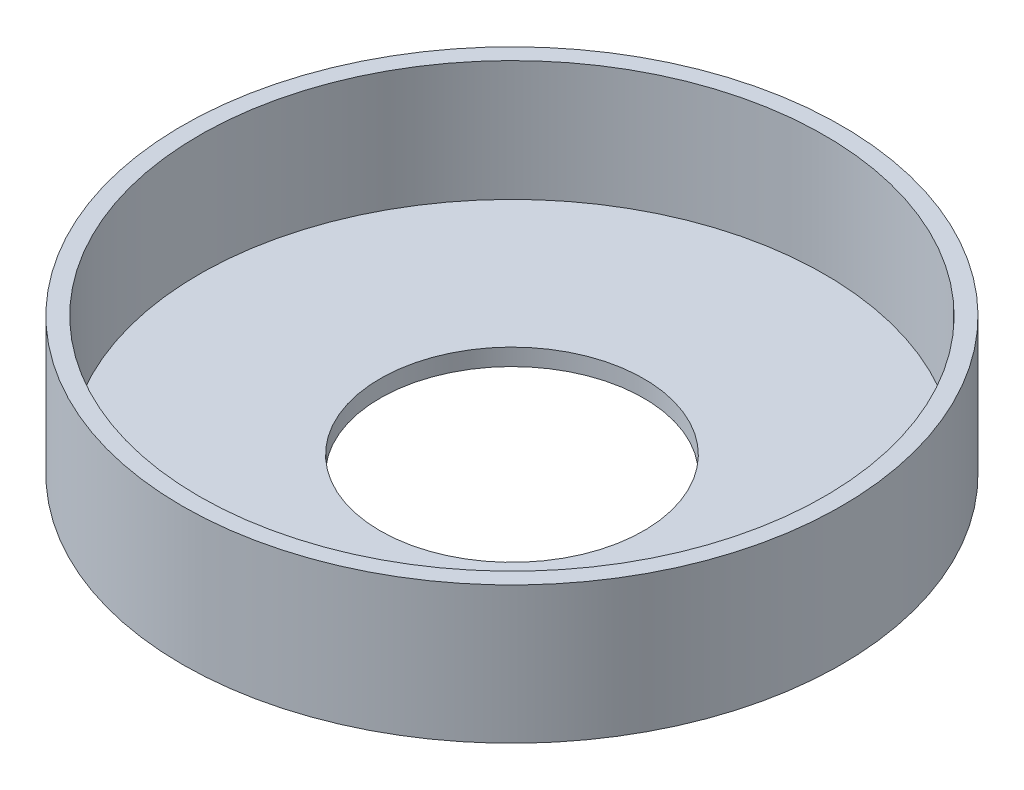
ISO-10303-21;
HEADER;
FILE_DESCRIPTION(('STEP AP214'),'2;1');
FILE_NAME('part.step','',(''),(''),'','','');
FILE_SCHEMA(('AUTOMOTIVE_DESIGN { 1 0 10303 214 1 1 1 1 }'));
ENDSEC;
DATA;
#1=APPLICATION_CONTEXT('core data for automotive mechanical design processes');
#2=APPLICATION_PROTOCOL_DEFINITION('international standard','automotive_design',2000,#1);
#3=PRODUCT_CONTEXT('',#1,'mechanical');
#4=PRODUCT('Part','Part','',(#3));
#5=PRODUCT_RELATED_PRODUCT_CATEGORY('part','',(#4));
#6=PRODUCT_DEFINITION_FORMATION('','',#4);
#7=PRODUCT_DEFINITION_CONTEXT('part definition',#1,'design');
#8=PRODUCT_DEFINITION('design','',#6,#7);
#9=PRODUCT_DEFINITION_SHAPE('','',#8);
#10=(LENGTH_UNIT() NAMED_UNIT(*) SI_UNIT(.MILLI.,.METRE.));
#11=(NAMED_UNIT(*) PLANE_ANGLE_UNIT() SI_UNIT($,.RADIAN.));
#12=(NAMED_UNIT(*) SI_UNIT($,.STERADIAN.) SOLID_ANGLE_UNIT());
#13=UNCERTAINTY_MEASURE_WITH_UNIT(LENGTH_MEASURE(1.E-05),#10,'distance_accuracy_value','');
#14=(GEOMETRIC_REPRESENTATION_CONTEXT(3) GLOBAL_UNCERTAINTY_ASSIGNED_CONTEXT((#13)) GLOBAL_UNIT_ASSIGNED_CONTEXT((#10,
#11,#12)) REPRESENTATION_CONTEXT('',''));
#15=CARTESIAN_POINT('',(0.,0.,0.));
#16=DIRECTION('',(0.,0.,1.));
#17=DIRECTION('',(1.,0.,0.));
#18=AXIS2_PLACEMENT_3D('',#15,#16,#17);
#19=CARTESIAN_POINT('',(0.,1.6,0.));
#20=DIRECTION('',(0.,1.,0.));
#21=DIRECTION('',(0.,0.,1.));
#22=AXIS2_PLACEMENT_3D('',#19,#20,#21);
#23=PLANE('',#22);
#24=CARTESIAN_POINT('',(0.,1.6,0.));
#25=DIRECTION('',(0.,1.,0.));
#26=DIRECTION('',(0.,0.,1.));
#27=AXIS2_PLACEMENT_3D('',#24,#25,#26);
#28=CIRCLE('',#27,12.5);
#29=CARTESIAN_POINT('',(0.,1.6,12.5));
#30=VERTEX_POINT('',#29);
#31=EDGE_CURVE('E41',#30,#30,#28,.T.);
#32=ORIENTED_EDGE('',*,*,#31,.F.);
#33=EDGE_LOOP('',(#32));
#34=FACE_BOUND('',#33,.T.);
#35=CARTESIAN_POINT('',(0.,1.6,0.));
#36=DIRECTION('',(0.,1.,0.));
#37=DIRECTION('',(0.,0.,1.));
#38=AXIS2_PLACEMENT_3D('',#35,#36,#37);
#39=CIRCLE('',#38,29.65);
#40=CARTESIAN_POINT('',(0.,1.6,29.65));
#41=VERTEX_POINT('',#40);
#42=EDGE_CURVE('E10',#41,#41,#39,.F.);
#43=ORIENTED_EDGE('',*,*,#42,.F.);
#44=EDGE_LOOP('',(#43));
#45=FACE_BOUND('',#44,.T.);
#46=ADVANCED_FACE('F30',(#34,#45),#23,.T.);
#47=CARTESIAN_POINT('',(0.,0.,0.));
#48=DIRECTION('',(0.,1.,0.));
#49=DIRECTION('',(0.,0.,1.));
#50=AXIS2_PLACEMENT_3D('',#47,#48,#49);
#51=PLANE('',#50);
#52=CARTESIAN_POINT('',(0.,0.,0.));
#53=DIRECTION('',(0.,1.,0.));
#54=DIRECTION('',(0.,0.,1.));
#55=AXIS2_PLACEMENT_3D('',#52,#53,#54);
#56=CIRCLE('',#55,31.25);
#57=CARTESIAN_POINT('',(0.,0.,31.25));
#58=VERTEX_POINT('',#57);
#59=EDGE_CURVE('E37',#58,#58,#56,.T.);
#60=ORIENTED_EDGE('',*,*,#59,.F.);
#61=EDGE_LOOP('',(#60));
#62=FACE_BOUND('',#61,.T.);
#63=CARTESIAN_POINT('',(0.,0.,0.));
#64=DIRECTION('',(0.,1.,0.));
#65=DIRECTION('',(0.,0.,1.));
#66=AXIS2_PLACEMENT_3D('',#63,#64,#65);
#67=CIRCLE('',#66,12.5);
#68=CARTESIAN_POINT('',(0.,0.,12.5));
#69=VERTEX_POINT('',#68);
#70=EDGE_CURVE('E45',#69,#69,#67,.T.);
#71=ORIENTED_EDGE('',*,*,#70,.T.);
#72=EDGE_LOOP('',(#71));
#73=FACE_BOUND('',#72,.T.);
#74=ADVANCED_FACE('F72',(#62,#73),#51,.F.);
#75=CARTESIAN_POINT('',(0.,1.6,0.));
#76=DIRECTION('',(0.,-1.,0.));
#77=DIRECTION('',(0.,0.,-1.));
#78=AXIS2_PLACEMENT_3D('',#75,#76,#77);
#79=CYLINDRICAL_SURFACE('',#78,31.25);
#80=ORIENTED_EDGE('',*,*,#59,.T.);
#81=EDGE_LOOP('',(#80));
#82=FACE_BOUND('',#81,.T.);
#83=CARTESIAN_POINT('',(0.,13.,0.));
#84=DIRECTION('',(0.,1.,0.));
#85=DIRECTION('',(0.,0.,1.));
#86=AXIS2_PLACEMENT_3D('',#83,#84,#85);
#87=CIRCLE('',#86,31.25);
#88=CARTESIAN_POINT('',(0.,13.,31.25));
#89=VERTEX_POINT('',#88);
#90=EDGE_CURVE('E49',#89,#89,#87,.T.);
#91=ORIENTED_EDGE('',*,*,#90,.F.);
#92=EDGE_LOOP('',(#91));
#93=FACE_BOUND('',#92,.T.);
#94=ADVANCED_FACE('F32',(#82,#93),#79,.T.);
#95=CARTESIAN_POINT('',(0.,1.6,0.));
#96=DIRECTION('',(0.,-1.,0.));
#97=DIRECTION('',(0.,0.,-1.));
#98=AXIS2_PLACEMENT_3D('',#95,#96,#97);
#99=CYLINDRICAL_SURFACE('',#98,12.5);
#100=ORIENTED_EDGE('',*,*,#31,.T.);
#101=EDGE_LOOP('',(#100));
#102=FACE_BOUND('',#101,.T.);
#103=ORIENTED_EDGE('',*,*,#70,.F.);
#104=EDGE_LOOP('',(#103));
#105=FACE_BOUND('',#104,.T.);
#106=ADVANCED_FACE('F61',(#102,#105),#99,.F.);
#107=CARTESIAN_POINT('',(0.,13.,0.));
#108=DIRECTION('',(0.,1.,0.));
#109=DIRECTION('',(0.,0.,1.));
#110=AXIS2_PLACEMENT_3D('',#107,#108,#109);
#111=PLANE('',#110);
#112=ORIENTED_EDGE('',*,*,#90,.T.);
#113=EDGE_LOOP('',(#112));
#114=FACE_BOUND('',#113,.T.);
#115=CARTESIAN_POINT('',(0.,13.,0.));
#116=DIRECTION('',(0.,1.,0.));
#117=DIRECTION('',(0.,0.,1.));
#118=AXIS2_PLACEMENT_3D('',#115,#116,#117);
#119=CIRCLE('',#118,29.65);
#120=CARTESIAN_POINT('',(0.,13.,29.65));
#121=VERTEX_POINT('',#120);
#122=EDGE_CURVE('E53',#121,#121,#119,.T.);
#123=ORIENTED_EDGE('',*,*,#122,.F.);
#124=EDGE_LOOP('',(#123));
#125=FACE_BOUND('',#124,.T.);
#126=ADVANCED_FACE('F59',(#114,#125),#111,.T.);
#127=CARTESIAN_POINT('',(0.,13.,0.));
#128=DIRECTION('',(0.,-1.,0.));
#129=DIRECTION('',(0.,0.,-1.));
#130=AXIS2_PLACEMENT_3D('',#127,#128,#129);
#131=CYLINDRICAL_SURFACE('',#130,29.65);
#132=ORIENTED_EDGE('',*,*,#122,.T.);
#133=EDGE_LOOP('',(#132));
#134=FACE_BOUND('',#133,.T.);
#135=ORIENTED_EDGE('',*,*,#42,.T.);
#136=EDGE_LOOP('',(#135));
#137=FACE_BOUND('',#136,.T.);
#138=ADVANCED_FACE('F57',(#134,#137),#131,.F.);
#139=CLOSED_SHELL('',(#46,#74,#94,#106,#126,#138));
#140=MANIFOLD_SOLID_BREP('B2',#139);
#141=ADVANCED_BREP_SHAPE_REPRESENTATION('',(#18,#140),#14);
#142=SHAPE_DEFINITION_REPRESENTATION(#9,#141);
ENDSEC;
END-ISO-10303-21;
